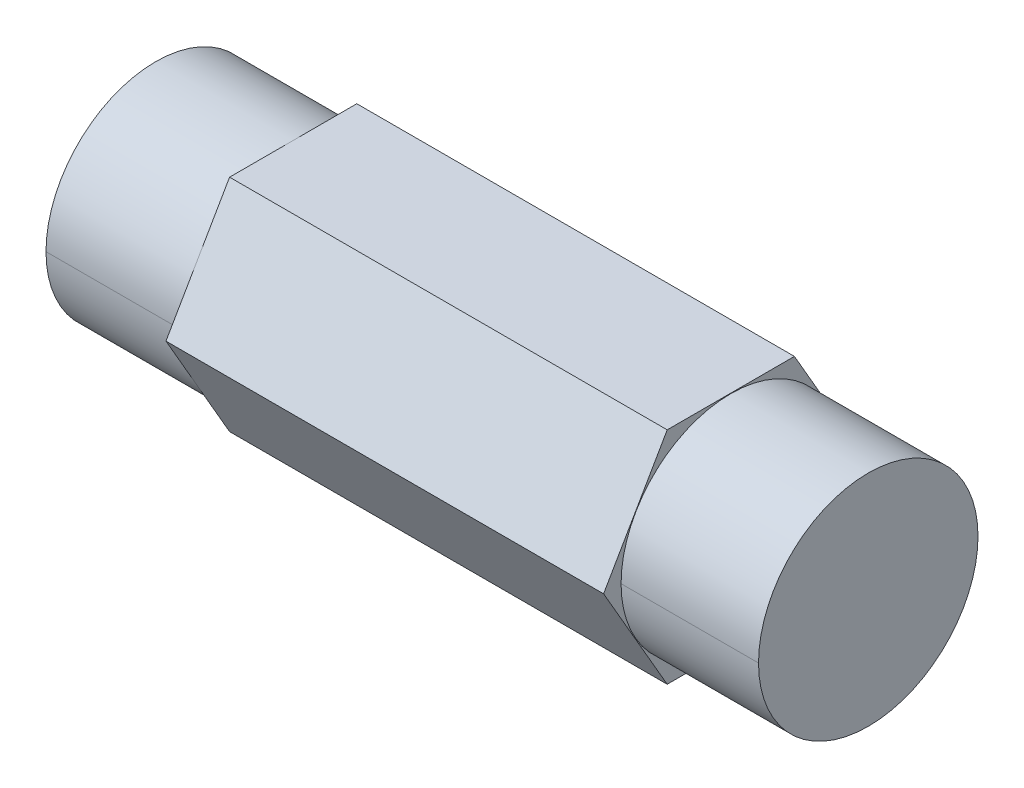
ISO-10303-21;
HEADER;
FILE_DESCRIPTION(('STEP AP214'),'2;1');
FILE_NAME('part.step','',(''),(''),'','','');
FILE_SCHEMA(('AUTOMOTIVE_DESIGN { 1 0 10303 214 1 1 1 1 }'));
ENDSEC;
DATA;
#1=APPLICATION_CONTEXT('core data for automotive mechanical design processes');
#2=APPLICATION_PROTOCOL_DEFINITION('international standard','automotive_design',2000,#1);
#3=PRODUCT_CONTEXT('',#1,'mechanical');
#4=PRODUCT('Part','Part','',(#3));
#5=PRODUCT_RELATED_PRODUCT_CATEGORY('part','',(#4));
#6=PRODUCT_DEFINITION_FORMATION('','',#4);
#7=PRODUCT_DEFINITION_CONTEXT('part definition',#1,'design');
#8=PRODUCT_DEFINITION('design','',#6,#7);
#9=PRODUCT_DEFINITION_SHAPE('','',#8);
#10=(LENGTH_UNIT() NAMED_UNIT(*) SI_UNIT(.MILLI.,.METRE.));
#11=(NAMED_UNIT(*) PLANE_ANGLE_UNIT() SI_UNIT($,.RADIAN.));
#12=(NAMED_UNIT(*) SI_UNIT($,.STERADIAN.) SOLID_ANGLE_UNIT());
#13=UNCERTAINTY_MEASURE_WITH_UNIT(LENGTH_MEASURE(1.E-05),#10,'distance_accuracy_value','');
#14=(GEOMETRIC_REPRESENTATION_CONTEXT(3) GLOBAL_UNCERTAINTY_ASSIGNED_CONTEXT((#13)) GLOBAL_UNIT_ASSIGNED_CONTEXT((#10,
#11,#12)) REPRESENTATION_CONTEXT('',''));
#15=CARTESIAN_POINT('',(0.,0.,0.));
#16=DIRECTION('',(0.,0.,1.));
#17=DIRECTION('',(1.,0.,0.));
#18=AXIS2_PLACEMENT_3D('',#15,#16,#17);
#19=CARTESIAN_POINT('',(-20.574,0.,0.));
#20=DIRECTION('',(-1.,0.,0.));
#21=DIRECTION('',(0.,0.,1.));
#22=AXIS2_PLACEMENT_3D('',#19,#20,#21);
#23=PLANE('',#22);
#24=CARTESIAN_POINT('',(-20.574,0.,0.));
#25=DIRECTION('',(1.,0.,0.));
#26=DIRECTION('',(0.,0.,-1.));
#27=AXIS2_PLACEMENT_3D('',#24,#25,#26);
#28=CIRCLE('',#27,6.3373);
#29=CARTESIAN_POINT('',(-20.574,0.,-6.3373));
#30=VERTEX_POINT('',#29);
#31=CARTESIAN_POINT('',(-20.574,0.,6.3373));
#32=VERTEX_POINT('',#31);
#33=EDGE_CURVE('E179',#30,#32,#28,.T.);
#34=ORIENTED_EDGE('',*,*,#33,.F.);
#35=CARTESIAN_POINT('',(-20.574,0.,0.));
#36=DIRECTION('',(1.,0.,0.));
#37=DIRECTION('',(0.,0.,-1.));
#38=AXIS2_PLACEMENT_3D('',#35,#36,#37);
#39=CIRCLE('',#38,6.3373);
#40=EDGE_CURVE('E11',#32,#30,#39,.T.);
#41=ORIENTED_EDGE('',*,*,#40,.F.);
#42=EDGE_LOOP('',(#34,#41));
#43=FACE_BOUND('',#42,.T.);
#44=ADVANCED_FACE('F16',(#43),#23,.T.);
#45=CARTESIAN_POINT('',(-20.574,0.,0.));
#46=DIRECTION('',(1.,0.,0.));
#47=DIRECTION('',(0.,0.,-1.));
#48=AXIS2_PLACEMENT_3D('',#45,#46,#47);
#49=CYLINDRICAL_SURFACE('',#48,6.3373);
#50=DIRECTION('',(1.,0.,0.));
#51=VECTOR('',#50,1.);
#52=CARTESIAN_POINT('',(-20.574,0.,6.3373));
#53=LINE('',#52,#51);
#54=CARTESIAN_POINT('',(-12.6365,0.,6.3373));
#55=VERTEX_POINT('',#54);
#56=EDGE_CURVE('E171',#32,#55,#53,.T.);
#57=ORIENTED_EDGE('',*,*,#56,.F.);
#58=ORIENTED_EDGE('',*,*,#40,.T.);
#59=DIRECTION('',(1.,0.,0.));
#60=VECTOR('',#59,1.);
#61=CARTESIAN_POINT('',(-20.574,0.,-6.3373));
#62=LINE('',#61,#60);
#63=CARTESIAN_POINT('',(-12.6365,0.,-6.3373));
#64=VERTEX_POINT('',#63);
#65=EDGE_CURVE('E154',#30,#64,#62,.T.);
#66=ORIENTED_EDGE('',*,*,#65,.T.);
#67=CARTESIAN_POINT('',(-12.6365,0.,0.));
#68=DIRECTION('',(1.,0.,0.));
#69=DIRECTION('',(0.,0.,-1.));
#70=AXIS2_PLACEMENT_3D('',#67,#68,#69);
#71=CIRCLE('',#70,6.3373);
#72=EDGE_CURVE('E182',#55,#64,#71,.T.);
#73=ORIENTED_EDGE('',*,*,#72,.F.);
#74=EDGE_LOOP('',(#57,#58,#66,#73));
#75=FACE_BOUND('',#74,.T.);
#76=ADVANCED_FACE('F255',(#75),#49,.T.);
#77=CARTESIAN_POINT('',(20.574,0.,0.));
#78=DIRECTION('',(1.,0.,0.));
#79=DIRECTION('',(0.,1.,0.));
#80=AXIS2_PLACEMENT_3D('',#77,#78,#79);
#81=PLANE('',#80);
#82=CARTESIAN_POINT('',(20.574,0.,0.));
#83=DIRECTION('',(1.,0.,0.));
#84=DIRECTION('',(0.,0.,-1.));
#85=AXIS2_PLACEMENT_3D('',#82,#83,#84);
#86=CIRCLE('',#85,6.3373);
#87=CARTESIAN_POINT('',(20.574,0.,6.3373));
#88=VERTEX_POINT('',#87);
#89=CARTESIAN_POINT('',(20.574,0.,-6.3373));
#90=VERTEX_POINT('',#89);
#91=EDGE_CURVE('E27',#88,#90,#86,.T.);
#92=ORIENTED_EDGE('',*,*,#91,.T.);
#93=CARTESIAN_POINT('',(20.574,0.,0.));
#94=DIRECTION('',(1.,0.,0.));
#95=DIRECTION('',(0.,0.,-1.));
#96=AXIS2_PLACEMENT_3D('',#93,#94,#95);
#97=CIRCLE('',#96,6.3373);
#98=EDGE_CURVE('E157',#90,#88,#97,.T.);
#99=ORIENTED_EDGE('',*,*,#98,.T.);
#100=EDGE_LOOP('',(#92,#99));
#101=FACE_BOUND('',#100,.T.);
#102=ADVANCED_FACE('F267',(#101),#81,.T.);
#103=CARTESIAN_POINT('',(20.574,0.,0.));
#104=DIRECTION('',(-1.,0.,0.));
#105=DIRECTION('',(0.,0.,1.));
#106=AXIS2_PLACEMENT_3D('',#103,#104,#105);
#107=CYLINDRICAL_SURFACE('',#106,6.3373);
#108=DIRECTION('',(-1.,0.,0.));
#109=VECTOR('',#108,1.);
#110=CARTESIAN_POINT('',(20.574,0.,-6.3373));
#111=LINE('',#110,#109);
#112=CARTESIAN_POINT('',(12.6365,0.,-6.3373));
#113=VERTEX_POINT('',#112);
#114=EDGE_CURVE('E167',#90,#113,#111,.T.);
#115=ORIENTED_EDGE('',*,*,#114,.F.);
#116=ORIENTED_EDGE('',*,*,#91,.F.);
#117=DIRECTION('',(-1.,0.,0.));
#118=VECTOR('',#117,1.);
#119=CARTESIAN_POINT('',(20.574,0.,6.3373));
#120=LINE('',#119,#118);
#121=CARTESIAN_POINT('',(12.6365,0.,6.3373));
#122=VERTEX_POINT('',#121);
#123=EDGE_CURVE('E142',#88,#122,#120,.T.);
#124=ORIENTED_EDGE('',*,*,#123,.T.);
#125=CARTESIAN_POINT('',(12.6365,0.,0.));
#126=DIRECTION('',(1.,0.,0.));
#127=DIRECTION('',(0.,0.,-1.));
#128=AXIS2_PLACEMENT_3D('',#125,#126,#127);
#129=CIRCLE('',#128,6.3373);
#130=EDGE_CURVE('E184',#122,#113,#129,.T.);
#131=ORIENTED_EDGE('',*,*,#130,.T.);
#132=EDGE_LOOP('',(#115,#116,#124,#131));
#133=FACE_BOUND('',#132,.T.);
#134=ADVANCED_FACE('F258',(#133),#107,.T.);
#135=CARTESIAN_POINT('',(-12.6365,0.,0.));
#136=DIRECTION('',(1.,0.,0.));
#137=DIRECTION('',(0.,1.,0.));
#138=AXIS2_PLACEMENT_3D('',#135,#136,#137);
#139=PLANE('',#138);
#140=CARTESIAN_POINT('',(-12.6365,0.,0.));
#141=DIRECTION('',(1.,0.,0.));
#142=DIRECTION('',(0.,0.,-1.));
#143=AXIS2_PLACEMENT_3D('',#140,#141,#142);
#144=CIRCLE('',#143,6.3373);
#145=EDGE_CURVE('E158',#64,#55,#144,.T.);
#146=ORIENTED_EDGE('',*,*,#145,.T.);
#147=ORIENTED_EDGE('',*,*,#72,.T.);
#148=EDGE_LOOP('',(#146,#147));
#149=FACE_BOUND('',#148,.T.);
#150=DIRECTION('',(0.,0.866025403784439,-0.5));
#151=VECTOR('',#150,1.);
#152=CARTESIAN_POINT('',(-12.6365,-6.36269999999978,-3.67350655777294));
#153=LINE('',#152,#151);
#154=CARTESIAN_POINT('',(-12.6365,-6.36269999999978,-3.67350655777294));
#155=VERTEX_POINT('',#154);
#156=CARTESIAN_POINT('',(-12.6365,1.11022302462516E-13,-7.34701311554575));
#157=VERTEX_POINT('',#156);
#158=EDGE_CURVE('E123',#155,#157,#153,.T.);
#159=ORIENTED_EDGE('',*,*,#158,.F.);
#160=DIRECTION('',(0.,0.,-1.));
#161=VECTOR('',#160,1.);
#162=CARTESIAN_POINT('',(-12.6365,-6.36269999999972,3.67350655777269));
#163=LINE('',#162,#161);
#164=CARTESIAN_POINT('',(-12.6365,-6.36269999999972,3.67350655777269));
#165=VERTEX_POINT('',#164);
#166=EDGE_CURVE('E192',#165,#155,#163,.T.);
#167=ORIENTED_EDGE('',*,*,#166,.F.);
#168=DIRECTION('',(0.,-0.866025403784438,-0.5));
#169=VECTOR('',#168,1.);
#170=CARTESIAN_POINT('',(-12.6365,1.11022302462516E-13,7.34701311554559));
#171=LINE('',#170,#169);
#172=CARTESIAN_POINT('',(-12.6365,1.11022302462516E-13,7.34701311554559));
#173=VERTEX_POINT('',#172);
#174=EDGE_CURVE('E207',#173,#165,#171,.T.);
#175=ORIENTED_EDGE('',*,*,#174,.F.);
#176=DIRECTION('',(0.,-0.866025403784439,0.5));
#177=VECTOR('',#176,1.);
#178=CARTESIAN_POINT('',(-12.6365,6.3627,3.67350655777279));
#179=LINE('',#178,#177);
#180=CARTESIAN_POINT('',(-12.6365,6.3627,3.67350655777279));
#181=VERTEX_POINT('',#180);
#182=EDGE_CURVE('E211',#181,#173,#179,.T.);
#183=ORIENTED_EDGE('',*,*,#182,.F.);
#184=DIRECTION('',(0.,0.,1.));
#185=VECTOR('',#184,1.);
#186=CARTESIAN_POINT('',(-12.6365,6.36270000000017,-3.67350655777296));
#187=LINE('',#186,#185);
#188=CARTESIAN_POINT('',(-12.6365,6.36270000000017,-3.67350655777296));
#189=VERTEX_POINT('',#188);
#190=EDGE_CURVE('E125',#189,#181,#187,.T.);
#191=ORIENTED_EDGE('',*,*,#190,.F.);
#192=DIRECTION('',(0.,0.866025403784439,0.5));
#193=VECTOR('',#192,1.);
#194=CARTESIAN_POINT('',(-12.6365,1.11022302462516E-13,-7.34701311554575));
#195=LINE('',#194,#193);
#196=EDGE_CURVE('E121',#157,#189,#195,.T.);
#197=ORIENTED_EDGE('',*,*,#196,.F.);
#198=EDGE_LOOP('',(#159,#167,#175,#183,#191,#197));
#199=FACE_BOUND('',#198,.T.);
#200=ADVANCED_FACE('F18',(#149,#199),#139,.F.);
#201=CARTESIAN_POINT('',(12.6365,0.,0.));
#202=DIRECTION('',(1.,0.,0.));
#203=DIRECTION('',(0.,1.,0.));
#204=AXIS2_PLACEMENT_3D('',#201,#202,#203);
#205=PLANE('',#204);
#206=ORIENTED_EDGE('',*,*,#130,.F.);
#207=CARTESIAN_POINT('',(12.6365,0.,0.));
#208=DIRECTION('',(1.,0.,0.));
#209=DIRECTION('',(0.,0.,-1.));
#210=AXIS2_PLACEMENT_3D('',#207,#208,#209);
#211=CIRCLE('',#210,6.3373);
#212=EDGE_CURVE('E149',#113,#122,#211,.T.);
#213=ORIENTED_EDGE('',*,*,#212,.F.);
#214=EDGE_LOOP('',(#206,#213));
#215=FACE_BOUND('',#214,.T.);
#216=DIRECTION('',(0.,0.866025403784439,-0.5));
#217=VECTOR('',#216,1.);
#218=CARTESIAN_POINT('',(12.6365,-6.36269999999978,-3.67350655777294));
#219=LINE('',#218,#217);
#220=CARTESIAN_POINT('',(12.6365,-6.36269999999978,-3.67350655777294));
#221=VERTEX_POINT('',#220);
#222=CARTESIAN_POINT('',(12.6365,1.11022302462516E-13,-7.34701311554575));
#223=VERTEX_POINT('',#222);
#224=EDGE_CURVE('E137',#221,#223,#219,.T.);
#225=ORIENTED_EDGE('',*,*,#224,.T.);
#226=DIRECTION('',(0.,0.866025403784439,0.5));
#227=VECTOR('',#226,1.);
#228=CARTESIAN_POINT('',(12.6365,1.11022302462516E-13,-7.34701311554575));
#229=LINE('',#228,#227);
#230=CARTESIAN_POINT('',(12.6365,6.36270000000017,-3.67350655777296));
#231=VERTEX_POINT('',#230);
#232=EDGE_CURVE('E112',#223,#231,#229,.T.);
#233=ORIENTED_EDGE('',*,*,#232,.T.);
#234=DIRECTION('',(0.,0.,1.));
#235=VECTOR('',#234,1.);
#236=CARTESIAN_POINT('',(12.6365,6.36270000000017,-3.67350655777296));
#237=LINE('',#236,#235);
#238=CARTESIAN_POINT('',(12.6365,6.3627,3.67350655777279));
#239=VERTEX_POINT('',#238);
#240=EDGE_CURVE('E20',#231,#239,#237,.T.);
#241=ORIENTED_EDGE('',*,*,#240,.T.);
#242=DIRECTION('',(0.,-0.866025403784439,0.5));
#243=VECTOR('',#242,1.);
#244=CARTESIAN_POINT('',(12.6365,6.3627,3.67350655777279));
#245=LINE('',#244,#243);
#246=CARTESIAN_POINT('',(12.6365,1.11022302462516E-13,7.34701311554559));
#247=VERTEX_POINT('',#246);
#248=EDGE_CURVE('E204',#239,#247,#245,.T.);
#249=ORIENTED_EDGE('',*,*,#248,.T.);
#250=DIRECTION('',(0.,-0.866025403784438,-0.5));
#251=VECTOR('',#250,1.);
#252=CARTESIAN_POINT('',(12.6365,1.11022302462516E-13,7.34701311554559));
#253=LINE('',#252,#251);
#254=CARTESIAN_POINT('',(12.6365,-6.36269999999972,3.67350655777269));
#255=VERTEX_POINT('',#254);
#256=EDGE_CURVE('E152',#247,#255,#253,.T.);
#257=ORIENTED_EDGE('',*,*,#256,.T.);
#258=DIRECTION('',(0.,0.,-1.));
#259=VECTOR('',#258,1.);
#260=CARTESIAN_POINT('',(12.6365,-6.36269999999972,3.67350655777269));
#261=LINE('',#260,#259);
#262=EDGE_CURVE('E42',#255,#221,#261,.T.);
#263=ORIENTED_EDGE('',*,*,#262,.T.);
#264=EDGE_LOOP('',(#225,#233,#241,#249,#257,#263));
#265=FACE_BOUND('',#264,.T.);
#266=ADVANCED_FACE('F257',(#215,#265),#205,.T.);
#267=CARTESIAN_POINT('',(12.6365,-6.36269999999972,3.67350655777269));
#268=DIRECTION('',(0.,1.,0.));
#269=DIRECTION('',(0.,0.,-1.));
#270=AXIS2_PLACEMENT_3D('',#267,#268,#269);
#271=PLANE('',#270);
#272=ORIENTED_EDGE('',*,*,#166,.T.);
#273=DIRECTION('',(-1.,0.,0.));
#274=VECTOR('',#273,1.);
#275=CARTESIAN_POINT('',(12.6365,-6.36269999999978,-3.67350655777294));
#276=LINE('',#275,#274);
#277=EDGE_CURVE('E129',#221,#155,#276,.T.);
#278=ORIENTED_EDGE('',*,*,#277,.F.);
#279=ORIENTED_EDGE('',*,*,#262,.F.);
#280=DIRECTION('',(-1.,0.,0.));
#281=VECTOR('',#280,1.);
#282=CARTESIAN_POINT('',(12.6365,-6.36269999999972,3.67350655777269));
#283=LINE('',#282,#281);
#284=EDGE_CURVE('E215',#255,#165,#283,.T.);
#285=ORIENTED_EDGE('',*,*,#284,.T.);
#286=EDGE_LOOP('',(#272,#278,#279,#285));
#287=FACE_BOUND('',#286,.T.);
#288=ADVANCED_FACE('F264',(#287),#271,.F.);
#289=CARTESIAN_POINT('',(12.6365,1.11022302462516E-13,7.34701311554559));
#290=DIRECTION('',(0.,0.5,-0.866025403784439));
#291=DIRECTION('',(-1.,0.,0.));
#292=AXIS2_PLACEMENT_3D('',#289,#290,#291);
#293=PLANE('',#292);
#294=ORIENTED_EDGE('',*,*,#174,.T.);
#295=ORIENTED_EDGE('',*,*,#284,.F.);
#296=ORIENTED_EDGE('',*,*,#256,.F.);
#297=DIRECTION('',(-1.,0.,0.));
#298=VECTOR('',#297,1.);
#299=CARTESIAN_POINT('',(12.6365,1.11022302462516E-13,7.34701311554559));
#300=LINE('',#299,#298);
#301=EDGE_CURVE('E208',#247,#173,#300,.T.);
#302=ORIENTED_EDGE('',*,*,#301,.T.);
#303=EDGE_LOOP('',(#294,#295,#296,#302));
#304=FACE_BOUND('',#303,.T.);
#305=ADVANCED_FACE('F280',(#304),#293,.F.);
#306=CARTESIAN_POINT('',(12.6365,6.3627,3.67350655777279));
#307=DIRECTION('',(0.,-0.5,-0.866025403784439));
#308=DIRECTION('',(0.,-0.866025403784439,0.5));
#309=AXIS2_PLACEMENT_3D('',#306,#307,#308);
#310=PLANE('',#309);
#311=ORIENTED_EDGE('',*,*,#182,.T.);
#312=ORIENTED_EDGE('',*,*,#301,.F.);
#313=ORIENTED_EDGE('',*,*,#248,.F.);
#314=DIRECTION('',(-1.,0.,0.));
#315=VECTOR('',#314,1.);
#316=CARTESIAN_POINT('',(12.6365,6.3627,3.67350655777279));
#317=LINE('',#316,#315);
#318=EDGE_CURVE('E221',#239,#181,#317,.T.);
#319=ORIENTED_EDGE('',*,*,#318,.T.);
#320=EDGE_LOOP('',(#311,#312,#313,#319));
#321=FACE_BOUND('',#320,.T.);
#322=ADVANCED_FACE('F282',(#321),#310,.F.);
#323=CARTESIAN_POINT('',(12.6365,6.36270000000017,-3.67350655777296));
#324=DIRECTION('',(0.,-1.,0.));
#325=DIRECTION('',(0.,0.,-1.));
#326=AXIS2_PLACEMENT_3D('',#323,#324,#325);
#327=PLANE('',#326);
#328=ORIENTED_EDGE('',*,*,#190,.T.);
#329=ORIENTED_EDGE('',*,*,#318,.F.);
#330=ORIENTED_EDGE('',*,*,#240,.F.);
#331=DIRECTION('',(-1.,0.,0.));
#332=VECTOR('',#331,1.);
#333=CARTESIAN_POINT('',(12.6365,6.36270000000017,-3.67350655777296));
#334=LINE('',#333,#332);
#335=EDGE_CURVE('E128',#231,#189,#334,.T.);
#336=ORIENTED_EDGE('',*,*,#335,.T.);
#337=EDGE_LOOP('',(#328,#329,#330,#336));
#338=FACE_BOUND('',#337,.T.);
#339=ADVANCED_FACE('F293',(#338),#327,.F.);
#340=CARTESIAN_POINT('',(12.6365,1.11022302462516E-13,-7.34701311554575));
#341=DIRECTION('',(0.,-0.5,0.866025403784439));
#342=DIRECTION('',(-1.,0.,0.));
#343=AXIS2_PLACEMENT_3D('',#340,#341,#342);
#344=PLANE('',#343);
#345=ORIENTED_EDGE('',*,*,#196,.T.);
#346=ORIENTED_EDGE('',*,*,#335,.F.);
#347=ORIENTED_EDGE('',*,*,#232,.F.);
#348=DIRECTION('',(-1.,0.,0.));
#349=VECTOR('',#348,1.);
#350=CARTESIAN_POINT('',(12.6365,1.11022302462516E-13,-7.34701311554575));
#351=LINE('',#350,#349);
#352=EDGE_CURVE('E132',#223,#157,#351,.T.);
#353=ORIENTED_EDGE('',*,*,#352,.T.);
#354=EDGE_LOOP('',(#345,#346,#347,#353));
#355=FACE_BOUND('',#354,.T.);
#356=ADVANCED_FACE('F133',(#355),#344,.F.);
#357=CARTESIAN_POINT('',(12.6365,-6.36269999999978,-3.67350655777294));
#358=DIRECTION('',(0.,0.5,0.866025403784439));
#359=DIRECTION('',(1.,0.,0.));
#360=AXIS2_PLACEMENT_3D('',#357,#358,#359);
#361=PLANE('',#360);
#362=ORIENTED_EDGE('',*,*,#158,.T.);
#363=ORIENTED_EDGE('',*,*,#352,.F.);
#364=ORIENTED_EDGE('',*,*,#224,.F.);
#365=ORIENTED_EDGE('',*,*,#277,.T.);
#366=EDGE_LOOP('',(#362,#363,#364,#365));
#367=FACE_BOUND('',#366,.T.);
#368=ADVANCED_FACE('F140',(#367),#361,.F.);
#369=CARTESIAN_POINT('',(20.574,0.,0.));
#370=DIRECTION('',(-1.,0.,0.));
#371=DIRECTION('',(0.,0.,1.));
#372=AXIS2_PLACEMENT_3D('',#369,#370,#371);
#373=CYLINDRICAL_SURFACE('',#372,6.3373);
#374=ORIENTED_EDGE('',*,*,#98,.F.);
#375=ORIENTED_EDGE('',*,*,#114,.T.);
#376=ORIENTED_EDGE('',*,*,#212,.T.);
#377=ORIENTED_EDGE('',*,*,#123,.F.);
#378=EDGE_LOOP('',(#374,#375,#376,#377));
#379=FACE_BOUND('',#378,.T.);
#380=ADVANCED_FACE('F277',(#379),#373,.T.);
#381=CARTESIAN_POINT('',(-20.574,0.,0.));
#382=DIRECTION('',(1.,0.,0.));
#383=DIRECTION('',(0.,0.,-1.));
#384=AXIS2_PLACEMENT_3D('',#381,#382,#383);
#385=CYLINDRICAL_SURFACE('',#384,6.3373);
#386=ORIENTED_EDGE('',*,*,#33,.T.);
#387=ORIENTED_EDGE('',*,*,#56,.T.);
#388=ORIENTED_EDGE('',*,*,#145,.F.);
#389=ORIENTED_EDGE('',*,*,#65,.F.);
#390=EDGE_LOOP('',(#386,#387,#388,#389));
#391=FACE_BOUND('',#390,.T.);
#392=ADVANCED_FACE('F252',(#391),#385,.T.);
#393=CLOSED_SHELL('',(#44,#76,#102,#134,#200,#266,#288,#305,#322,#339,#356,#368,#380,#392));
#394=MANIFOLD_SOLID_BREP('B1',#393);
#395=ADVANCED_BREP_SHAPE_REPRESENTATION('',(#18,#394),#14);
#396=SHAPE_DEFINITION_REPRESENTATION(#9,#395);
ENDSEC;
END-ISO-10303-21;
